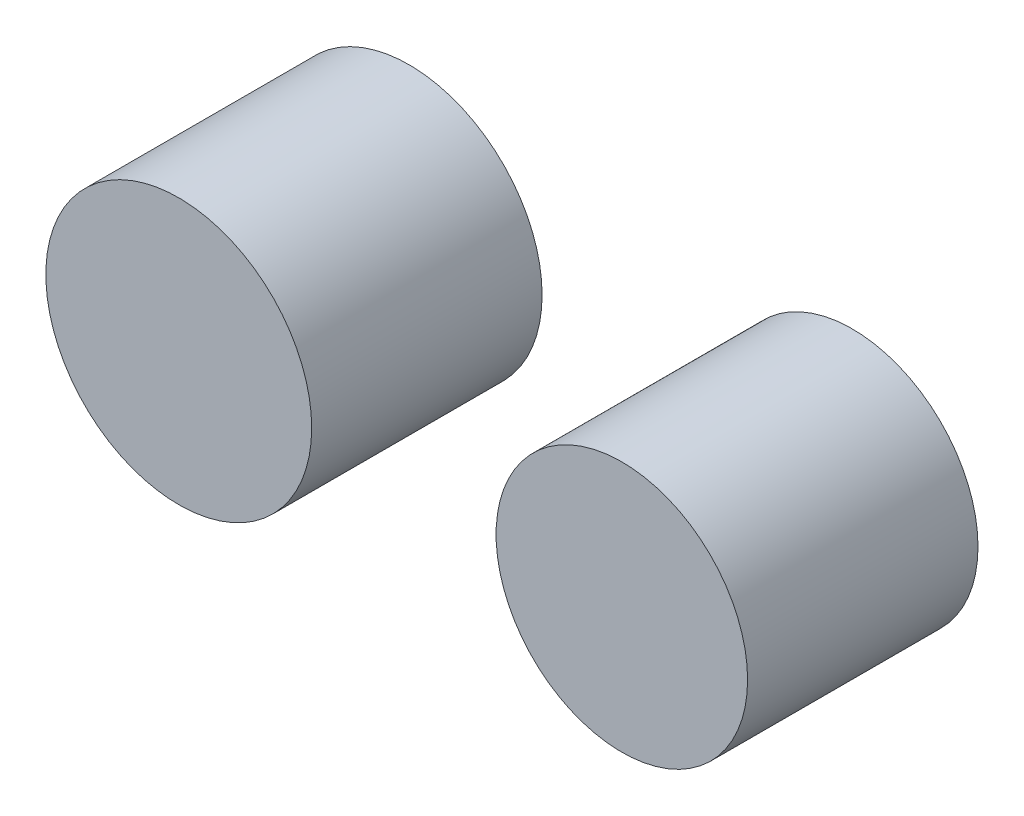
ISO-10303-21;
HEADER;
FILE_DESCRIPTION(('STEP AP214'),'2;1');
FILE_NAME('part.step','',(''),(''),'','','');
FILE_SCHEMA(('AUTOMOTIVE_DESIGN { 1 0 10303 214 1 1 1 1 }'));
ENDSEC;
DATA;
#1=APPLICATION_CONTEXT('core data for automotive mechanical design processes');
#2=APPLICATION_PROTOCOL_DEFINITION('international standard','automotive_design',2000,#1);
#3=PRODUCT_CONTEXT('',#1,'mechanical');
#4=PRODUCT('Part','Part','',(#3));
#5=PRODUCT_RELATED_PRODUCT_CATEGORY('part','',(#4));
#6=PRODUCT_DEFINITION_FORMATION('','',#4);
#7=PRODUCT_DEFINITION_CONTEXT('part definition',#1,'design');
#8=PRODUCT_DEFINITION('design','',#6,#7);
#9=PRODUCT_DEFINITION_SHAPE('','',#8);
#10=(LENGTH_UNIT() NAMED_UNIT(*) SI_UNIT(.MILLI.,.METRE.));
#11=(NAMED_UNIT(*) PLANE_ANGLE_UNIT() SI_UNIT($,.RADIAN.));
#12=(NAMED_UNIT(*) SI_UNIT($,.STERADIAN.) SOLID_ANGLE_UNIT());
#13=UNCERTAINTY_MEASURE_WITH_UNIT(LENGTH_MEASURE(1.E-05),#10,'distance_accuracy_value','');
#14=(GEOMETRIC_REPRESENTATION_CONTEXT(3) GLOBAL_UNCERTAINTY_ASSIGNED_CONTEXT((#13)) GLOBAL_UNIT_ASSIGNED_CONTEXT((#10,
#11,#12)) REPRESENTATION_CONTEXT('',''));
#15=CARTESIAN_POINT('',(0.,0.,0.));
#16=DIRECTION('',(0.,0.,1.));
#17=DIRECTION('',(1.,0.,0.));
#18=AXIS2_PLACEMENT_3D('',#15,#16,#17);
#19=CARTESIAN_POINT('',(5.,0.,2.6));
#20=DIRECTION('',(0.,0.,-1.));
#21=DIRECTION('',(-1.,0.,0.));
#22=AXIS2_PLACEMENT_3D('',#19,#20,#21);
#23=CYLINDRICAL_SURFACE('',#22,1.41911553049386);
#24=CARTESIAN_POINT('',(5.,0.,2.6));
#25=DIRECTION('',(0.,0.,1.));
#26=DIRECTION('',(1.,0.,0.));
#27=AXIS2_PLACEMENT_3D('',#24,#25,#26);
#28=CIRCLE('',#27,1.41911553049386);
#29=CARTESIAN_POINT('',(6.41911553049386,0.,2.6));
#30=VERTEX_POINT('',#29);
#31=EDGE_CURVE('E53',#30,#30,#28,.T.);
#32=ORIENTED_EDGE('',*,*,#31,.F.);
#33=EDGE_LOOP('',(#32));
#34=FACE_BOUND('',#33,.T.);
#35=CARTESIAN_POINT('',(5.,0.,0.));
#36=DIRECTION('',(0.,0.,1.));
#37=DIRECTION('',(1.,0.,0.));
#38=AXIS2_PLACEMENT_3D('',#35,#36,#37);
#39=CIRCLE('',#38,1.41911553049386);
#40=CARTESIAN_POINT('',(6.41911553049386,0.,0.));
#41=VERTEX_POINT('',#40);
#42=EDGE_CURVE('E11',#41,#41,#39,.T.);
#43=ORIENTED_EDGE('',*,*,#42,.T.);
#44=EDGE_LOOP('',(#43));
#45=FACE_BOUND('',#44,.T.);
#46=ADVANCED_FACE('F49',(#34,#45),#23,.T.);
#47=CARTESIAN_POINT('',(5.,0.,2.6));
#48=DIRECTION('',(0.,0.,1.));
#49=DIRECTION('',(1.,0.,0.));
#50=AXIS2_PLACEMENT_3D('',#47,#48,#49);
#51=PLANE('',#50);
#52=ORIENTED_EDGE('',*,*,#31,.T.);
#53=EDGE_LOOP('',(#52));
#54=FACE_BOUND('',#53,.T.);
#55=ADVANCED_FACE('F51',(#54),#51,.T.);
#56=CARTESIAN_POINT('',(5.,0.,0.));
#57=DIRECTION('',(0.,0.,1.));
#58=DIRECTION('',(1.,0.,0.));
#59=AXIS2_PLACEMENT_3D('',#56,#57,#58);
#60=PLANE('',#59);
#61=ORIENTED_EDGE('',*,*,#42,.F.);
#62=EDGE_LOOP('',(#61));
#63=FACE_BOUND('',#62,.T.);
#64=ADVANCED_FACE('F68',(#63),#60,.F.);
#65=CLOSED_SHELL('',(#46,#55,#64));
#66=MANIFOLD_SOLID_BREP('B2',#65);
#67=CARTESIAN_POINT('',(0.,0.,2.6));
#68=DIRECTION('',(0.,0.,-1.));
#69=DIRECTION('',(-1.,0.,0.));
#70=AXIS2_PLACEMENT_3D('',#67,#68,#69);
#71=CYLINDRICAL_SURFACE('',#70,1.5);
#72=CARTESIAN_POINT('',(0.,0.,2.6));
#73=DIRECTION('',(0.,0.,1.));
#74=DIRECTION('',(1.,0.,0.));
#75=AXIS2_PLACEMENT_3D('',#72,#73,#74);
#76=CIRCLE('',#75,1.5);
#77=CARTESIAN_POINT('',(1.5,0.,2.6));
#78=VERTEX_POINT('',#77);
#79=EDGE_CURVE('E48',#78,#78,#76,.T.);
#80=ORIENTED_EDGE('',*,*,#79,.F.);
#81=EDGE_LOOP('',(#80));
#82=FACE_BOUND('',#81,.T.);
#83=CARTESIAN_POINT('',(0.,0.,0.));
#84=DIRECTION('',(0.,0.,1.));
#85=DIRECTION('',(1.,0.,0.));
#86=AXIS2_PLACEMENT_3D('',#83,#84,#85);
#87=CIRCLE('',#86,1.5);
#88=CARTESIAN_POINT('',(1.5,0.,0.));
#89=VERTEX_POINT('',#88);
#90=EDGE_CURVE('E99',#89,#89,#87,.T.);
#91=ORIENTED_EDGE('',*,*,#90,.T.);
#92=EDGE_LOOP('',(#91));
#93=FACE_BOUND('',#92,.T.);
#94=ADVANCED_FACE('F96',(#82,#93),#71,.T.);
#95=CARTESIAN_POINT('',(0.,0.,2.6));
#96=DIRECTION('',(0.,0.,1.));
#97=DIRECTION('',(1.,0.,0.));
#98=AXIS2_PLACEMENT_3D('',#95,#96,#97);
#99=PLANE('',#98);
#100=ORIENTED_EDGE('',*,*,#79,.T.);
#101=EDGE_LOOP('',(#100));
#102=FACE_BOUND('',#101,.T.);
#103=ADVANCED_FACE('F113',(#102),#99,.T.);
#104=CARTESIAN_POINT('',(0.,0.,0.));
#105=DIRECTION('',(0.,0.,1.));
#106=DIRECTION('',(1.,0.,0.));
#107=AXIS2_PLACEMENT_3D('',#104,#105,#106);
#108=PLANE('',#107);
#109=ORIENTED_EDGE('',*,*,#90,.F.);
#110=EDGE_LOOP('',(#109));
#111=FACE_BOUND('',#110,.T.);
#112=ADVANCED_FACE('F111',(#111),#108,.F.);
#113=CLOSED_SHELL('',(#94,#103,#112));
#114=MANIFOLD_SOLID_BREP('B6',#113);
#115=ADVANCED_BREP_SHAPE_REPRESENTATION('',(#18,#66,#114),#14);
#116=SHAPE_DEFINITION_REPRESENTATION(#9,#115);
ENDSEC;
END-ISO-10303-21;
